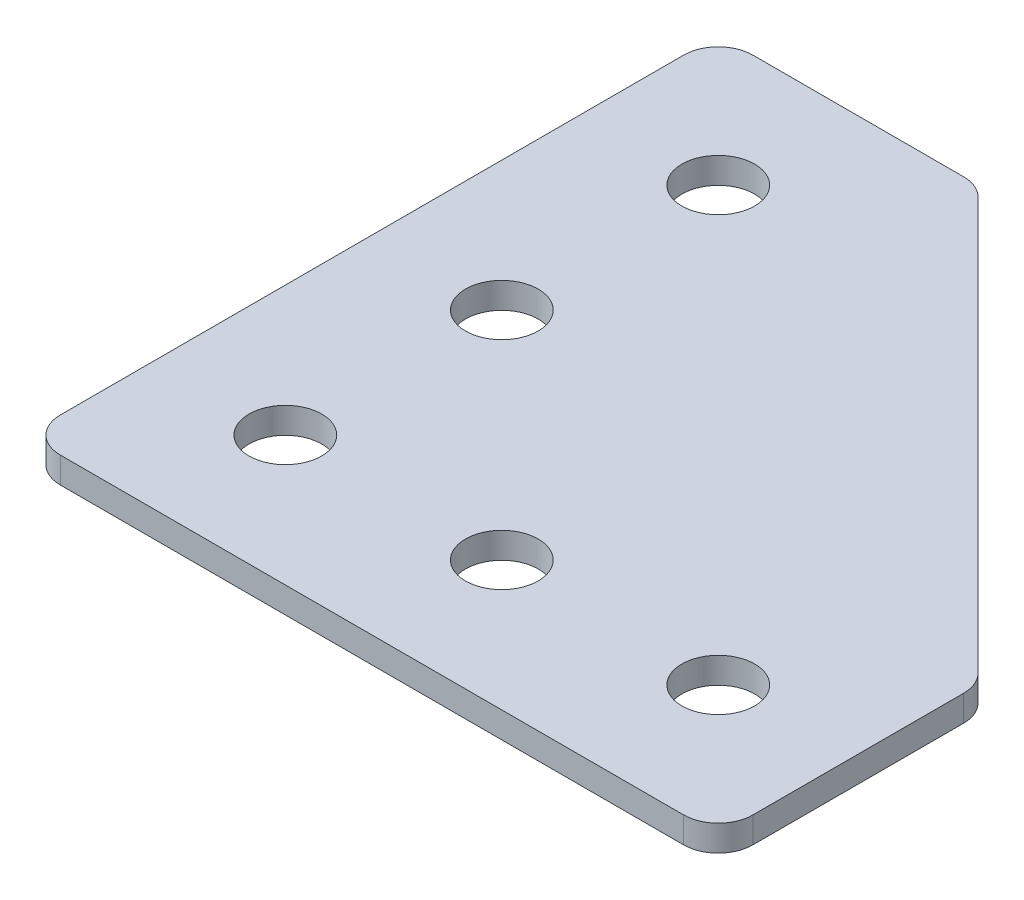
ISO-10303-21;
HEADER;
FILE_DESCRIPTION(('STEP AP214'),'2;1');
FILE_NAME('part.step','',(''),(''),'','','');
FILE_SCHEMA(('AUTOMOTIVE_DESIGN { 1 0 10303 214 1 1 1 1 }'));
ENDSEC;
DATA;
#1=APPLICATION_CONTEXT('core data for automotive mechanical design processes');
#2=APPLICATION_PROTOCOL_DEFINITION('international standard','automotive_design',2000,#1);
#3=PRODUCT_CONTEXT('',#1,'mechanical');
#4=PRODUCT('Part','Part','',(#3));
#5=PRODUCT_RELATED_PRODUCT_CATEGORY('part','',(#4));
#6=PRODUCT_DEFINITION_FORMATION('','',#4);
#7=PRODUCT_DEFINITION_CONTEXT('part definition',#1,'design');
#8=PRODUCT_DEFINITION('design','',#6,#7);
#9=PRODUCT_DEFINITION_SHAPE('','',#8);
#10=(LENGTH_UNIT() NAMED_UNIT(*) SI_UNIT(.MILLI.,.METRE.));
#11=(NAMED_UNIT(*) PLANE_ANGLE_UNIT() SI_UNIT($,.RADIAN.));
#12=(NAMED_UNIT(*) SI_UNIT($,.STERADIAN.) SOLID_ANGLE_UNIT());
#13=UNCERTAINTY_MEASURE_WITH_UNIT(LENGTH_MEASURE(1.E-05),#10,'distance_accuracy_value','');
#14=(GEOMETRIC_REPRESENTATION_CONTEXT(3) GLOBAL_UNCERTAINTY_ASSIGNED_CONTEXT((#13)) GLOBAL_UNIT_ASSIGNED_CONTEXT((#10,
#11,#12)) REPRESENTATION_CONTEXT('',''));
#15=CARTESIAN_POINT('',(0.,0.,0.));
#16=DIRECTION('',(0.,0.,1.));
#17=DIRECTION('',(1.,0.,0.));
#18=AXIS2_PLACEMENT_3D('',#15,#16,#17);
#19=CARTESIAN_POINT('',(0.,1.5,0.));
#20=DIRECTION('',(0.,1.,0.));
#21=DIRECTION('',(0.,0.,1.));
#22=AXIS2_PLACEMENT_3D('',#19,#20,#21);
#23=PLANE('',#22);
#24=CARTESIAN_POINT('',(20.,1.5,-7.5));
#25=DIRECTION('',(0.,1.,0.));
#26=DIRECTION('',(0.,0.,1.));
#27=AXIS2_PLACEMENT_3D('',#24,#25,#26);
#28=CIRCLE('',#27,2.1);
#29=CARTESIAN_POINT('',(20.,1.5,-5.4));
#30=VERTEX_POINT('',#29);
#31=EDGE_CURVE('E212',#30,#30,#28,.T.);
#32=ORIENTED_EDGE('',*,*,#31,.F.);
#33=EDGE_LOOP('',(#32));
#34=FACE_BOUND('',#33,.T.);
#35=CARTESIAN_POINT('',(32.5,1.5,-7.5));
#36=DIRECTION('',(0.,1.,0.));
#37=DIRECTION('',(0.,0.,1.));
#38=AXIS2_PLACEMENT_3D('',#35,#36,#37);
#39=CIRCLE('',#38,2.1);
#40=CARTESIAN_POINT('',(32.5,1.5,-5.4));
#41=VERTEX_POINT('',#40);
#42=EDGE_CURVE('E213',#41,#41,#39,.T.);
#43=ORIENTED_EDGE('',*,*,#42,.F.);
#44=EDGE_LOOP('',(#43));
#45=FACE_BOUND('',#44,.T.);
#46=DIRECTION('',(0.,0.,1.));
#47=VECTOR('',#46,1.);
#48=CARTESIAN_POINT('',(0.,1.5,-40.));
#49=LINE('',#48,#47);
#50=CARTESIAN_POINT('',(0.,1.5,-38.));
#51=VERTEX_POINT('',#50);
#52=CARTESIAN_POINT('',(0.,1.5,-2.));
#53=VERTEX_POINT('',#52);
#54=EDGE_CURVE('E160',#51,#53,#49,.T.);
#55=ORIENTED_EDGE('',*,*,#54,.T.);
#56=CARTESIAN_POINT('',(2.,1.5,-2.));
#57=DIRECTION('',(0.,1.,0.));
#58=DIRECTION('',(0.,0.,1.));
#59=AXIS2_PLACEMENT_3D('',#56,#57,#58);
#60=CIRCLE('',#59,2.);
#61=CARTESIAN_POINT('',(2.,1.5,0.));
#62=VERTEX_POINT('',#61);
#63=EDGE_CURVE('E236',#53,#62,#60,.T.);
#64=ORIENTED_EDGE('',*,*,#63,.T.);
#65=DIRECTION('',(1.,0.,0.));
#66=VECTOR('',#65,1.);
#67=CARTESIAN_POINT('',(0.,1.5,0.));
#68=LINE('',#67,#66);
#69=CARTESIAN_POINT('',(38.,1.5,0.));
#70=VERTEX_POINT('',#69);
#71=EDGE_CURVE('E139',#62,#70,#68,.T.);
#72=ORIENTED_EDGE('',*,*,#71,.T.);
#73=CARTESIAN_POINT('',(38.,1.5,-2.));
#74=DIRECTION('',(0.,1.,0.));
#75=DIRECTION('',(0.,0.,1.));
#76=AXIS2_PLACEMENT_3D('',#73,#74,#75);
#77=CIRCLE('',#76,2.);
#78=CARTESIAN_POINT('',(40.,1.5,-2.));
#79=VERTEX_POINT('',#78);
#80=EDGE_CURVE('E242',#70,#79,#77,.T.);
#81=ORIENTED_EDGE('',*,*,#80,.T.);
#82=DIRECTION('',(0.,0.,-1.));
#83=VECTOR('',#82,1.);
#84=CARTESIAN_POINT('',(40.,1.5,0.));
#85=LINE('',#84,#83);
#86=CARTESIAN_POINT('',(40.,1.5,-14.1715728752538));
#87=VERTEX_POINT('',#86);
#88=EDGE_CURVE('E271',#79,#87,#85,.T.);
#89=ORIENTED_EDGE('',*,*,#88,.T.);
#90=CARTESIAN_POINT('',(38.,1.5,-14.1715728752538));
#91=DIRECTION('',(0.,1.,0.));
#92=DIRECTION('',(0.,0.,1.));
#93=AXIS2_PLACEMENT_3D('',#90,#91,#92);
#94=CIRCLE('',#93,2.);
#95=CARTESIAN_POINT('',(39.4142135623731,1.5,-15.5857864376269));
#96=VERTEX_POINT('',#95);
#97=EDGE_CURVE('E280',#87,#96,#94,.T.);
#98=ORIENTED_EDGE('',*,*,#97,.T.);
#99=DIRECTION('',(-0.707106781186547,0.,-0.707106781186547));
#100=VECTOR('',#99,1.);
#101=CARTESIAN_POINT('',(40.,1.5,-15.));
#102=LINE('',#101,#100);
#103=CARTESIAN_POINT('',(15.5857864376269,1.5,-39.4142135623731));
#104=VERTEX_POINT('',#103);
#105=EDGE_CURVE('E259',#96,#104,#102,.T.);
#106=ORIENTED_EDGE('',*,*,#105,.T.);
#107=CARTESIAN_POINT('',(14.1715728752538,1.5,-38.));
#108=DIRECTION('',(0.,1.,0.));
#109=DIRECTION('',(0.,0.,1.));
#110=AXIS2_PLACEMENT_3D('',#107,#108,#109);
#111=CIRCLE('',#110,2.);
#112=CARTESIAN_POINT('',(14.1715728752538,1.5,-40.));
#113=VERTEX_POINT('',#112);
#114=EDGE_CURVE('E62',#104,#113,#111,.T.);
#115=ORIENTED_EDGE('',*,*,#114,.T.);
#116=DIRECTION('',(-1.,0.,0.));
#117=VECTOR('',#116,1.);
#118=CARTESIAN_POINT('',(15.,1.5,-40.));
#119=LINE('',#118,#117);
#120=CARTESIAN_POINT('',(2.,1.5,-40.));
#121=VERTEX_POINT('',#120);
#122=EDGE_CURVE('E161',#113,#121,#119,.T.);
#123=ORIENTED_EDGE('',*,*,#122,.T.);
#124=CARTESIAN_POINT('',(2.,1.5,-38.));
#125=DIRECTION('',(0.,1.,0.));
#126=DIRECTION('',(0.,0.,1.));
#127=AXIS2_PLACEMENT_3D('',#124,#125,#126);
#128=CIRCLE('',#127,2.);
#129=EDGE_CURVE('E172',#121,#51,#128,.T.);
#130=ORIENTED_EDGE('',*,*,#129,.T.);
#131=EDGE_LOOP('',(#55,#64,#72,#81,#89,#98,#106,#115,#123,#130));
#132=FACE_BOUND('',#131,.T.);
#133=CARTESIAN_POINT('',(7.5,1.5,-7.5));
#134=DIRECTION('',(0.,1.,0.));
#135=DIRECTION('',(0.,0.,1.));
#136=AXIS2_PLACEMENT_3D('',#133,#134,#135);
#137=CIRCLE('',#136,2.1);
#138=CARTESIAN_POINT('',(7.5,1.5,-5.4));
#139=VERTEX_POINT('',#138);
#140=EDGE_CURVE('E152',#139,#139,#137,.T.);
#141=ORIENTED_EDGE('',*,*,#140,.F.);
#142=EDGE_LOOP('',(#141));
#143=FACE_BOUND('',#142,.T.);
#144=CARTESIAN_POINT('',(7.5,1.5,-32.5));
#145=DIRECTION('',(0.,1.,0.));
#146=DIRECTION('',(0.,0.,-1.));
#147=AXIS2_PLACEMENT_3D('',#144,#145,#146);
#148=CIRCLE('',#147,2.1);
#149=CARTESIAN_POINT('',(7.5,1.5,-34.6));
#150=VERTEX_POINT('',#149);
#151=EDGE_CURVE('E201',#150,#150,#148,.T.);
#152=ORIENTED_EDGE('',*,*,#151,.F.);
#153=EDGE_LOOP('',(#152));
#154=FACE_BOUND('',#153,.T.);
#155=CARTESIAN_POINT('',(7.5,1.5,-20.));
#156=DIRECTION('',(0.,1.,0.));
#157=DIRECTION('',(0.,0.,1.));
#158=AXIS2_PLACEMENT_3D('',#155,#156,#157);
#159=CIRCLE('',#158,2.1);
#160=CARTESIAN_POINT('',(7.5,1.5,-17.9));
#161=VERTEX_POINT('',#160);
#162=EDGE_CURVE('E376',#161,#161,#159,.T.);
#163=ORIENTED_EDGE('',*,*,#162,.F.);
#164=EDGE_LOOP('',(#163));
#165=FACE_BOUND('',#164,.T.);
#166=ADVANCED_FACE('F41',(#34,#45,#132,#143,#154,#165),#23,.T.);
#167=CARTESIAN_POINT('',(0.,0.,0.));
#168=DIRECTION('',(0.,1.,0.));
#169=DIRECTION('',(0.,0.,1.));
#170=AXIS2_PLACEMENT_3D('',#167,#168,#169);
#171=PLANE('',#170);
#172=DIRECTION('',(1.,0.,0.));
#173=VECTOR('',#172,1.);
#174=CARTESIAN_POINT('',(0.,0.,0.));
#175=LINE('',#174,#173);
#176=CARTESIAN_POINT('',(2.,0.,0.));
#177=VERTEX_POINT('',#176);
#178=CARTESIAN_POINT('',(38.,0.,0.));
#179=VERTEX_POINT('',#178);
#180=EDGE_CURVE('E136',#177,#179,#175,.T.);
#181=ORIENTED_EDGE('',*,*,#180,.F.);
#182=CARTESIAN_POINT('',(2.,0.,-2.));
#183=DIRECTION('',(0.,1.,0.));
#184=DIRECTION('',(0.,0.,1.));
#185=AXIS2_PLACEMENT_3D('',#182,#183,#184);
#186=CIRCLE('',#185,2.);
#187=CARTESIAN_POINT('',(0.,0.,-2.));
#188=VERTEX_POINT('',#187);
#189=EDGE_CURVE('E119',#177,#188,#186,.F.);
#190=ORIENTED_EDGE('',*,*,#189,.T.);
#191=DIRECTION('',(0.,0.,1.));
#192=VECTOR('',#191,1.);
#193=CARTESIAN_POINT('',(0.,0.,-40.));
#194=LINE('',#193,#192);
#195=CARTESIAN_POINT('',(0.,0.,-38.));
#196=VERTEX_POINT('',#195);
#197=EDGE_CURVE('E147',#196,#188,#194,.T.);
#198=ORIENTED_EDGE('',*,*,#197,.F.);
#199=CARTESIAN_POINT('',(2.,0.,-38.));
#200=DIRECTION('',(0.,1.,0.));
#201=DIRECTION('',(0.,0.,1.));
#202=AXIS2_PLACEMENT_3D('',#199,#200,#201);
#203=CIRCLE('',#202,2.);
#204=CARTESIAN_POINT('',(2.,0.,-40.));
#205=VERTEX_POINT('',#204);
#206=EDGE_CURVE('E140',#196,#205,#203,.F.);
#207=ORIENTED_EDGE('',*,*,#206,.T.);
#208=DIRECTION('',(-1.,0.,0.));
#209=VECTOR('',#208,1.);
#210=CARTESIAN_POINT('',(15.,0.,-40.));
#211=LINE('',#210,#209);
#212=CARTESIAN_POINT('',(14.1715728752538,0.,-40.));
#213=VERTEX_POINT('',#212);
#214=EDGE_CURVE('E158',#213,#205,#211,.T.);
#215=ORIENTED_EDGE('',*,*,#214,.F.);
#216=CARTESIAN_POINT('',(14.1715728752538,0.,-38.));
#217=DIRECTION('',(0.,1.,0.));
#218=DIRECTION('',(0.,0.,1.));
#219=AXIS2_PLACEMENT_3D('',#216,#217,#218);
#220=CIRCLE('',#219,2.);
#221=CARTESIAN_POINT('',(15.5857864376269,0.,-39.4142135623731));
#222=VERTEX_POINT('',#221);
#223=EDGE_CURVE('E164',#213,#222,#220,.F.);
#224=ORIENTED_EDGE('',*,*,#223,.T.);
#225=DIRECTION('',(-0.707106781186547,0.,-0.707106781186547));
#226=VECTOR('',#225,1.);
#227=CARTESIAN_POINT('',(40.,0.,-15.));
#228=LINE('',#227,#226);
#229=CARTESIAN_POINT('',(39.4142135623731,0.,-15.5857864376269));
#230=VERTEX_POINT('',#229);
#231=EDGE_CURVE('E150',#230,#222,#228,.T.);
#232=ORIENTED_EDGE('',*,*,#231,.F.);
#233=CARTESIAN_POINT('',(38.,0.,-14.1715728752538));
#234=DIRECTION('',(0.,1.,0.));
#235=DIRECTION('',(0.,0.,1.));
#236=AXIS2_PLACEMENT_3D('',#233,#234,#235);
#237=CIRCLE('',#236,2.);
#238=CARTESIAN_POINT('',(40.,0.,-14.1715728752538));
#239=VERTEX_POINT('',#238);
#240=EDGE_CURVE('E166',#230,#239,#237,.F.);
#241=ORIENTED_EDGE('',*,*,#240,.T.);
#242=DIRECTION('',(0.,0.,-1.));
#243=VECTOR('',#242,1.);
#244=CARTESIAN_POINT('',(40.,0.,0.));
#245=LINE('',#244,#243);
#246=CARTESIAN_POINT('',(40.,0.,-2.));
#247=VERTEX_POINT('',#246);
#248=EDGE_CURVE('E146',#247,#239,#245,.T.);
#249=ORIENTED_EDGE('',*,*,#248,.F.);
#250=CARTESIAN_POINT('',(38.,0.,-2.));
#251=DIRECTION('',(0.,1.,0.));
#252=DIRECTION('',(0.,0.,1.));
#253=AXIS2_PLACEMENT_3D('',#250,#251,#252);
#254=CIRCLE('',#253,2.);
#255=EDGE_CURVE('E130',#247,#179,#254,.F.);
#256=ORIENTED_EDGE('',*,*,#255,.T.);
#257=EDGE_LOOP('',(#181,#190,#198,#207,#215,#224,#232,#241,#249,#256));
#258=FACE_BOUND('',#257,.T.);
#259=CARTESIAN_POINT('',(7.5,0.,-7.5));
#260=DIRECTION('',(0.,1.,0.));
#261=DIRECTION('',(0.,0.,1.));
#262=AXIS2_PLACEMENT_3D('',#259,#260,#261);
#263=CIRCLE('',#262,2.1);
#264=CARTESIAN_POINT('',(7.5,0.,-5.4));
#265=VERTEX_POINT('',#264);
#266=EDGE_CURVE('E193',#265,#265,#263,.T.);
#267=ORIENTED_EDGE('',*,*,#266,.T.);
#268=EDGE_LOOP('',(#267));
#269=FACE_BOUND('',#268,.T.);
#270=CARTESIAN_POINT('',(32.5,0.,-7.5));
#271=DIRECTION('',(0.,1.,0.));
#272=DIRECTION('',(0.,0.,1.));
#273=AXIS2_PLACEMENT_3D('',#270,#271,#272);
#274=CIRCLE('',#273,2.1);
#275=CARTESIAN_POINT('',(32.5,0.,-5.4));
#276=VERTEX_POINT('',#275);
#277=EDGE_CURVE('E194',#276,#276,#274,.T.);
#278=ORIENTED_EDGE('',*,*,#277,.T.);
#279=EDGE_LOOP('',(#278));
#280=FACE_BOUND('',#279,.T.);
#281=CARTESIAN_POINT('',(7.5,0.,-32.5));
#282=DIRECTION('',(0.,1.,0.));
#283=DIRECTION('',(0.,0.,-1.));
#284=AXIS2_PLACEMENT_3D('',#281,#282,#283);
#285=CIRCLE('',#284,2.1);
#286=CARTESIAN_POINT('',(7.5,0.,-34.6));
#287=VERTEX_POINT('',#286);
#288=EDGE_CURVE('E207',#287,#287,#285,.T.);
#289=ORIENTED_EDGE('',*,*,#288,.T.);
#290=EDGE_LOOP('',(#289));
#291=FACE_BOUND('',#290,.T.);
#292=CARTESIAN_POINT('',(20.,0.,-7.5));
#293=DIRECTION('',(0.,1.,0.));
#294=DIRECTION('',(0.,0.,1.));
#295=AXIS2_PLACEMENT_3D('',#292,#293,#294);
#296=CIRCLE('',#295,2.1);
#297=CARTESIAN_POINT('',(20.,0.,-5.4));
#298=VERTEX_POINT('',#297);
#299=EDGE_CURVE('E208',#298,#298,#296,.T.);
#300=ORIENTED_EDGE('',*,*,#299,.T.);
#301=EDGE_LOOP('',(#300));
#302=FACE_BOUND('',#301,.T.);
#303=CARTESIAN_POINT('',(7.5,0.,-20.));
#304=DIRECTION('',(0.,1.,0.));
#305=DIRECTION('',(0.,0.,1.));
#306=AXIS2_PLACEMENT_3D('',#303,#304,#305);
#307=CIRCLE('',#306,2.1);
#308=CARTESIAN_POINT('',(7.5,0.,-17.9));
#309=VERTEX_POINT('',#308);
#310=EDGE_CURVE('E375',#309,#309,#307,.T.);
#311=ORIENTED_EDGE('',*,*,#310,.T.);
#312=EDGE_LOOP('',(#311));
#313=FACE_BOUND('',#312,.T.);
#314=ADVANCED_FACE('F143',(#258,#269,#280,#291,#302,#313),#171,.F.);
#315=CARTESIAN_POINT('',(0.,1.5,-40.));
#316=DIRECTION('',(1.,0.,0.));
#317=DIRECTION('',(0.,0.,-1.));
#318=AXIS2_PLACEMENT_3D('',#315,#316,#317);
#319=PLANE('',#318);
#320=ORIENTED_EDGE('',*,*,#197,.T.);
#321=DIRECTION('',(0.,-1.,0.));
#322=VECTOR('',#321,1.);
#323=CARTESIAN_POINT('',(0.,1.5,-2.));
#324=LINE('',#323,#322);
#325=EDGE_CURVE('E124',#188,#53,#324,.F.);
#326=ORIENTED_EDGE('',*,*,#325,.T.);
#327=ORIENTED_EDGE('',*,*,#54,.F.);
#328=DIRECTION('',(0.,-1.,0.));
#329=VECTOR('',#328,1.);
#330=CARTESIAN_POINT('',(0.,1.5,-38.));
#331=LINE('',#330,#329);
#332=EDGE_CURVE('E129',#51,#196,#331,.T.);
#333=ORIENTED_EDGE('',*,*,#332,.T.);
#334=EDGE_LOOP('',(#320,#326,#327,#333));
#335=FACE_BOUND('',#334,.T.);
#336=ADVANCED_FACE('F317',(#335),#319,.F.);
#337=CARTESIAN_POINT('',(0.,1.5,0.));
#338=DIRECTION('',(0.,0.,-1.));
#339=DIRECTION('',(-1.,0.,0.));
#340=AXIS2_PLACEMENT_3D('',#337,#338,#339);
#341=PLANE('',#340);
#342=ORIENTED_EDGE('',*,*,#71,.F.);
#343=DIRECTION('',(0.,-1.,0.));
#344=VECTOR('',#343,1.);
#345=CARTESIAN_POINT('',(2.,1.5,0.));
#346=LINE('',#345,#344);
#347=EDGE_CURVE('E123',#62,#177,#346,.T.);
#348=ORIENTED_EDGE('',*,*,#347,.T.);
#349=ORIENTED_EDGE('',*,*,#180,.T.);
#350=DIRECTION('',(0.,-1.,0.));
#351=VECTOR('',#350,1.);
#352=CARTESIAN_POINT('',(38.,1.5,0.));
#353=LINE('',#352,#351);
#354=EDGE_CURVE('E141',#179,#70,#353,.F.);
#355=ORIENTED_EDGE('',*,*,#354,.T.);
#356=EDGE_LOOP('',(#342,#348,#349,#355));
#357=FACE_BOUND('',#356,.T.);
#358=ADVANCED_FACE('F135',(#357),#341,.F.);
#359=CARTESIAN_POINT('',(40.,1.5,0.));
#360=DIRECTION('',(-1.,0.,0.));
#361=DIRECTION('',(0.,0.,1.));
#362=AXIS2_PLACEMENT_3D('',#359,#360,#361);
#363=PLANE('',#362);
#364=ORIENTED_EDGE('',*,*,#88,.F.);
#365=DIRECTION('',(0.,-1.,0.));
#366=VECTOR('',#365,1.);
#367=CARTESIAN_POINT('',(40.,1.5,-2.));
#368=LINE('',#367,#366);
#369=EDGE_CURVE('E246',#79,#247,#368,.T.);
#370=ORIENTED_EDGE('',*,*,#369,.T.);
#371=ORIENTED_EDGE('',*,*,#248,.T.);
#372=DIRECTION('',(0.,-1.,0.));
#373=VECTOR('',#372,1.);
#374=CARTESIAN_POINT('',(40.,1.5,-14.1715728752538));
#375=LINE('',#374,#373);
#376=EDGE_CURVE('E241',#239,#87,#375,.F.);
#377=ORIENTED_EDGE('',*,*,#376,.T.);
#378=EDGE_LOOP('',(#364,#370,#371,#377));
#379=FACE_BOUND('',#378,.T.);
#380=ADVANCED_FACE('F301',(#379),#363,.F.);
#381=CARTESIAN_POINT('',(40.,1.5,-15.));
#382=DIRECTION('',(-0.707106781186548,0.,0.707106781186548));
#383=DIRECTION('',(0.707106781186548,0.,0.707106781186548));
#384=AXIS2_PLACEMENT_3D('',#381,#382,#383);
#385=PLANE('',#384);
#386=ORIENTED_EDGE('',*,*,#105,.F.);
#387=DIRECTION('',(0.,-1.,0.));
#388=VECTOR('',#387,1.);
#389=CARTESIAN_POINT('',(39.4142135623731,1.5,-15.5857864376269));
#390=LINE('',#389,#388);
#391=EDGE_CURVE('E251',#96,#230,#390,.T.);
#392=ORIENTED_EDGE('',*,*,#391,.T.);
#393=ORIENTED_EDGE('',*,*,#231,.T.);
#394=DIRECTION('',(0.,-1.,0.));
#395=VECTOR('',#394,1.);
#396=CARTESIAN_POINT('',(15.5857864376269,1.5,-39.4142135623731));
#397=LINE('',#396,#395);
#398=EDGE_CURVE('E249',#222,#104,#397,.F.);
#399=ORIENTED_EDGE('',*,*,#398,.T.);
#400=EDGE_LOOP('',(#386,#392,#393,#399));
#401=FACE_BOUND('',#400,.T.);
#402=ADVANCED_FACE('F257',(#401),#385,.F.);
#403=CARTESIAN_POINT('',(15.,1.5,-40.));
#404=DIRECTION('',(0.,0.,1.));
#405=DIRECTION('',(1.,0.,0.));
#406=AXIS2_PLACEMENT_3D('',#403,#404,#405);
#407=PLANE('',#406);
#408=ORIENTED_EDGE('',*,*,#122,.F.);
#409=DIRECTION('',(0.,-1.,0.));
#410=VECTOR('',#409,1.);
#411=CARTESIAN_POINT('',(14.1715728752538,1.5,-40.));
#412=LINE('',#411,#410);
#413=EDGE_CURVE('E12',#113,#213,#412,.T.);
#414=ORIENTED_EDGE('',*,*,#413,.T.);
#415=ORIENTED_EDGE('',*,*,#214,.T.);
#416=DIRECTION('',(0.,-1.,0.));
#417=VECTOR('',#416,1.);
#418=CARTESIAN_POINT('',(2.,1.5,-40.));
#419=LINE('',#418,#417);
#420=EDGE_CURVE('E49',#205,#121,#419,.F.);
#421=ORIENTED_EDGE('',*,*,#420,.T.);
#422=EDGE_LOOP('',(#408,#414,#415,#421));
#423=FACE_BOUND('',#422,.T.);
#424=ADVANCED_FACE('F266',(#423),#407,.F.);
#425=CARTESIAN_POINT('',(7.5,1.5,-7.5));
#426=DIRECTION('',(0.,-1.,0.));
#427=DIRECTION('',(0.,0.,-1.));
#428=AXIS2_PLACEMENT_3D('',#425,#426,#427);
#429=CYLINDRICAL_SURFACE('',#428,2.1);
#430=ORIENTED_EDGE('',*,*,#140,.T.);
#431=EDGE_LOOP('',(#430));
#432=FACE_BOUND('',#431,.T.);
#433=ORIENTED_EDGE('',*,*,#266,.F.);
#434=EDGE_LOOP('',(#433));
#435=FACE_BOUND('',#434,.T.);
#436=ADVANCED_FACE('F322',(#432,#435),#429,.F.);
#437=CARTESIAN_POINT('',(32.5,1.5,-7.5));
#438=DIRECTION('',(0.,-1.,0.));
#439=DIRECTION('',(0.,0.,-1.));
#440=AXIS2_PLACEMENT_3D('',#437,#438,#439);
#441=CYLINDRICAL_SURFACE('',#440,2.1);
#442=ORIENTED_EDGE('',*,*,#42,.T.);
#443=EDGE_LOOP('',(#442));
#444=FACE_BOUND('',#443,.T.);
#445=ORIENTED_EDGE('',*,*,#277,.F.);
#446=EDGE_LOOP('',(#445));
#447=FACE_BOUND('',#446,.T.);
#448=ADVANCED_FACE('F354',(#444,#447),#441,.F.);
#449=CARTESIAN_POINT('',(7.5,1.5,-32.5));
#450=DIRECTION('',(0.,-1.,0.));
#451=DIRECTION('',(0.,0.,-1.));
#452=AXIS2_PLACEMENT_3D('',#449,#450,#451);
#453=CYLINDRICAL_SURFACE('',#452,2.1);
#454=ORIENTED_EDGE('',*,*,#151,.T.);
#455=EDGE_LOOP('',(#454));
#456=FACE_BOUND('',#455,.T.);
#457=ORIENTED_EDGE('',*,*,#288,.F.);
#458=EDGE_LOOP('',(#457));
#459=FACE_BOUND('',#458,.T.);
#460=ADVANCED_FACE('F347',(#456,#459),#453,.F.);
#461=CARTESIAN_POINT('',(20.,1.5,-7.5));
#462=DIRECTION('',(0.,-1.,0.));
#463=DIRECTION('',(0.,0.,-1.));
#464=AXIS2_PLACEMENT_3D('',#461,#462,#463);
#465=CYLINDRICAL_SURFACE('',#464,2.1);
#466=ORIENTED_EDGE('',*,*,#31,.T.);
#467=EDGE_LOOP('',(#466));
#468=FACE_BOUND('',#467,.T.);
#469=ORIENTED_EDGE('',*,*,#299,.F.);
#470=EDGE_LOOP('',(#469));
#471=FACE_BOUND('',#470,.T.);
#472=ADVANCED_FACE('F341',(#468,#471),#465,.F.);
#473=CARTESIAN_POINT('',(7.5,1.5,-20.));
#474=DIRECTION('',(0.,-1.,0.));
#475=DIRECTION('',(0.,0.,-1.));
#476=AXIS2_PLACEMENT_3D('',#473,#474,#475);
#477=CYLINDRICAL_SURFACE('',#476,2.1);
#478=ORIENTED_EDGE('',*,*,#162,.T.);
#479=EDGE_LOOP('',(#478));
#480=FACE_BOUND('',#479,.T.);
#481=ORIENTED_EDGE('',*,*,#310,.F.);
#482=EDGE_LOOP('',(#481));
#483=FACE_BOUND('',#482,.T.);
#484=ADVANCED_FACE('F337',(#480,#483),#477,.F.);
#485=CARTESIAN_POINT('',(2.,1.5,-2.));
#486=DIRECTION('',(0.,-1.,0.));
#487=DIRECTION('',(0.,0.,-1.));
#488=AXIS2_PLACEMENT_3D('',#485,#486,#487);
#489=CYLINDRICAL_SURFACE('',#488,2.);
#490=ORIENTED_EDGE('',*,*,#63,.F.);
#491=ORIENTED_EDGE('',*,*,#325,.F.);
#492=ORIENTED_EDGE('',*,*,#189,.F.);
#493=ORIENTED_EDGE('',*,*,#347,.F.);
#494=EDGE_LOOP('',(#490,#491,#492,#493));
#495=FACE_BOUND('',#494,.T.);
#496=ADVANCED_FACE('F122',(#495),#489,.T.);
#497=CARTESIAN_POINT('',(38.,1.5,-2.));
#498=DIRECTION('',(0.,-1.,0.));
#499=DIRECTION('',(0.,0.,-1.));
#500=AXIS2_PLACEMENT_3D('',#497,#498,#499);
#501=CYLINDRICAL_SURFACE('',#500,2.);
#502=ORIENTED_EDGE('',*,*,#80,.F.);
#503=ORIENTED_EDGE('',*,*,#354,.F.);
#504=ORIENTED_EDGE('',*,*,#255,.F.);
#505=ORIENTED_EDGE('',*,*,#369,.F.);
#506=EDGE_LOOP('',(#502,#503,#504,#505));
#507=FACE_BOUND('',#506,.T.);
#508=ADVANCED_FACE('F299',(#507),#501,.T.);
#509=CARTESIAN_POINT('',(38.,1.5,-14.1715728752538));
#510=DIRECTION('',(0.,-1.,0.));
#511=DIRECTION('',(0.,0.,-1.));
#512=AXIS2_PLACEMENT_3D('',#509,#510,#511);
#513=CYLINDRICAL_SURFACE('',#512,2.);
#514=ORIENTED_EDGE('',*,*,#97,.F.);
#515=ORIENTED_EDGE('',*,*,#376,.F.);
#516=ORIENTED_EDGE('',*,*,#240,.F.);
#517=ORIENTED_EDGE('',*,*,#391,.F.);
#518=EDGE_LOOP('',(#514,#515,#516,#517));
#519=FACE_BOUND('',#518,.T.);
#520=ADVANCED_FACE('F303',(#519),#513,.T.);
#521=CARTESIAN_POINT('',(14.1715728752538,1.5,-38.));
#522=DIRECTION('',(0.,-1.,0.));
#523=DIRECTION('',(0.,0.,-1.));
#524=AXIS2_PLACEMENT_3D('',#521,#522,#523);
#525=CYLINDRICAL_SURFACE('',#524,2.);
#526=ORIENTED_EDGE('',*,*,#114,.F.);
#527=ORIENTED_EDGE('',*,*,#398,.F.);
#528=ORIENTED_EDGE('',*,*,#223,.F.);
#529=ORIENTED_EDGE('',*,*,#413,.F.);
#530=EDGE_LOOP('',(#526,#527,#528,#529));
#531=FACE_BOUND('',#530,.T.);
#532=ADVANCED_FACE('F265',(#531),#525,.T.);
#533=CARTESIAN_POINT('',(2.,1.5,-38.));
#534=DIRECTION('',(0.,-1.,0.));
#535=DIRECTION('',(0.,0.,-1.));
#536=AXIS2_PLACEMENT_3D('',#533,#534,#535);
#537=CYLINDRICAL_SURFACE('',#536,2.);
#538=ORIENTED_EDGE('',*,*,#129,.F.);
#539=ORIENTED_EDGE('',*,*,#420,.F.);
#540=ORIENTED_EDGE('',*,*,#206,.F.);
#541=ORIENTED_EDGE('',*,*,#332,.F.);
#542=EDGE_LOOP('',(#538,#539,#540,#541));
#543=FACE_BOUND('',#542,.T.);
#544=ADVANCED_FACE('F43',(#543),#537,.T.);
#545=CLOSED_SHELL('',(#166,#314,#336,#358,#380,#402,#424,#436,#448,#460,#472,#484,#496,#508,
#520,#532,#544));
#546=MANIFOLD_SOLID_BREP('B2',#545);
#547=ADVANCED_BREP_SHAPE_REPRESENTATION('',(#18,#546),#14);
#548=SHAPE_DEFINITION_REPRESENTATION(#9,#547);
ENDSEC;
END-ISO-10303-21;
